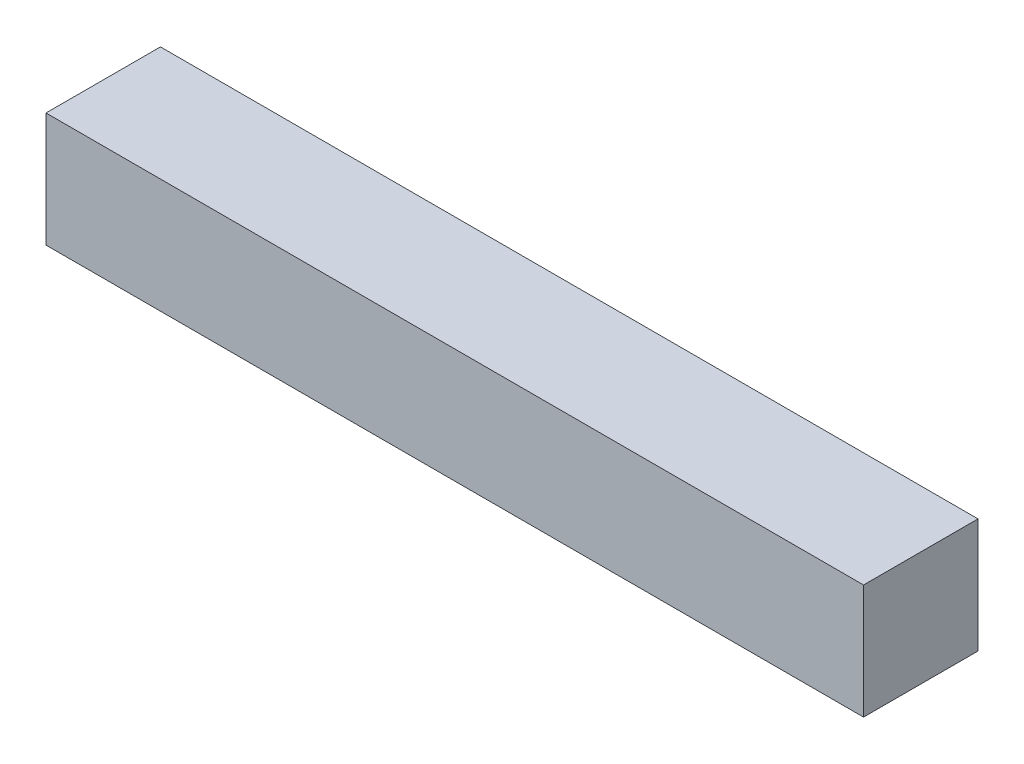
ISO-10303-21;
HEADER;
FILE_DESCRIPTION(('STEP AP214'),'2;1');
FILE_NAME('part.step','',(''),(''),'','','');
FILE_SCHEMA(('AUTOMOTIVE_DESIGN { 1 0 10303 214 1 1 1 1 }'));
ENDSEC;
DATA;
#1=APPLICATION_CONTEXT('core data for automotive mechanical design processes');
#2=APPLICATION_PROTOCOL_DEFINITION('international standard','automotive_design',2000,#1);
#3=PRODUCT_CONTEXT('',#1,'mechanical');
#4=PRODUCT('Part','Part','',(#3));
#5=PRODUCT_RELATED_PRODUCT_CATEGORY('part','',(#4));
#6=PRODUCT_DEFINITION_FORMATION('','',#4);
#7=PRODUCT_DEFINITION_CONTEXT('part definition',#1,'design');
#8=PRODUCT_DEFINITION('design','',#6,#7);
#9=PRODUCT_DEFINITION_SHAPE('','',#8);
#10=(LENGTH_UNIT() NAMED_UNIT(*) SI_UNIT(.MILLI.,.METRE.));
#11=(NAMED_UNIT(*) PLANE_ANGLE_UNIT() SI_UNIT($,.RADIAN.));
#12=(NAMED_UNIT(*) SI_UNIT($,.STERADIAN.) SOLID_ANGLE_UNIT());
#13=UNCERTAINTY_MEASURE_WITH_UNIT(LENGTH_MEASURE(1.E-05),#10,'distance_accuracy_value','');
#14=(GEOMETRIC_REPRESENTATION_CONTEXT(3) GLOBAL_UNCERTAINTY_ASSIGNED_CONTEXT((#13)) GLOBAL_UNIT_ASSIGNED_CONTEXT((#10,
#11,#12)) REPRESENTATION_CONTEXT('',''));
#15=CARTESIAN_POINT('',(0.,0.,0.));
#16=DIRECTION('',(0.,0.,1.));
#17=DIRECTION('',(1.,0.,0.));
#18=AXIS2_PLACEMENT_3D('',#15,#16,#17);
#19=CARTESIAN_POINT('',(0.,0.,0.));
#20=DIRECTION('',(0.,0.,1.));
#21=DIRECTION('',(1.,0.,0.));
#22=AXIS2_PLACEMENT_3D('',#19,#20,#21);
#23=PLANE('',#22);
#24=DIRECTION('',(0.,-1.,0.));
#25=VECTOR('',#24,1.);
#26=CARTESIAN_POINT('',(-15000.,7000.,0.));
#27=LINE('',#26,#25);
#28=CARTESIAN_POINT('',(-15000.,7000.,0.));
#29=VERTEX_POINT('',#28);
#30=CARTESIAN_POINT('',(-15000.,0.,0.));
#31=VERTEX_POINT('',#30);
#32=EDGE_CURVE('E345',#29,#31,#27,.T.);
#33=ORIENTED_EDGE('',*,*,#32,.F.);
#34=DIRECTION('',(-1.,0.,0.));
#35=VECTOR('',#34,1.);
#36=CARTESIAN_POINT('',(35000.,7000.,0.));
#37=LINE('',#36,#35);
#38=CARTESIAN_POINT('',(35000.,7000.,0.));
#39=VERTEX_POINT('',#38);
#40=EDGE_CURVE('E95',#39,#29,#37,.T.);
#41=ORIENTED_EDGE('',*,*,#40,.F.);
#42=DIRECTION('',(0.,1.,0.));
#43=VECTOR('',#42,1.);
#44=CARTESIAN_POINT('',(35000.,0.,0.));
#45=LINE('',#44,#43);
#46=CARTESIAN_POINT('',(35000.,0.,0.));
#47=VERTEX_POINT('',#46);
#48=EDGE_CURVE('E343',#47,#39,#45,.T.);
#49=ORIENTED_EDGE('',*,*,#48,.F.);
#50=DIRECTION('',(1.,0.,0.));
#51=VECTOR('',#50,1.);
#52=CARTESIAN_POINT('',(-15000.,0.,0.));
#53=LINE('',#52,#51);
#54=EDGE_CURVE('E334',#31,#47,#53,.T.);
#55=ORIENTED_EDGE('',*,*,#54,.F.);
#56=EDGE_LOOP('',(#33,#41,#49,#55));
#57=FACE_BOUND('',#56,.T.);
#58=DIRECTION('',(0.,-1.,0.));
#59=VECTOR('',#58,1.);
#60=CARTESIAN_POINT('',(99.9066587836865,800.,0.));
#61=LINE('',#60,#59);
#62=CARTESIAN_POINT('',(99.9066587836865,158.611679528378,0.));
#63=VERTEX_POINT('',#62);
#64=CARTESIAN_POINT('',(99.9066587836865,474.242430461089,0.));
#65=VERTEX_POINT('',#64);
#66=EDGE_CURVE('E11',#63,#65,#61,.F.);
#67=ORIENTED_EDGE('',*,*,#66,.F.);
#68=CARTESIAN_POINT('',(150.,300.,0.));
#69=DIRECTION('',(0.,0.,1.));
#70=DIRECTION('',(1.,0.,0.));
#71=AXIS2_PLACEMENT_3D('',#68,#69,#70);
#72=CIRCLE('',#71,150.);
#73=CARTESIAN_POINT('',(150.,150.,0.));
#74=VERTEX_POINT('',#73);
#75=EDGE_CURVE('E380',#63,#74,#72,.T.);
#76=ORIENTED_EDGE('',*,*,#75,.T.);
#77=DIRECTION('',(1.,0.,0.));
#78=VECTOR('',#77,1.);
#79=CARTESIAN_POINT('',(0.,150.,0.));
#80=LINE('',#79,#78);
#81=CARTESIAN_POINT('',(2301.451,150.,0.));
#82=VERTEX_POINT('',#81);
#83=EDGE_CURVE('E367',#74,#82,#80,.T.);
#84=ORIENTED_EDGE('',*,*,#83,.T.);
#85=DIRECTION('',(0.999048223992947,0.0436193321422773,0.));
#86=VECTOR('',#85,1.);
#87=CARTESIAN_POINT('',(-2.15782559269287,49.4223941585042,0.));
#88=LINE('',#87,#86);
#89=CARTESIAN_POINT('',(4861.84624149669,261.789128664863,0.));
#90=VERTEX_POINT('',#89);
#91=EDGE_CURVE('E370',#82,#90,#88,.T.);
#92=ORIENTED_EDGE('',*,*,#91,.T.);
#93=DIRECTION('',(0.,-1.,0.));
#94=VECTOR('',#93,1.);
#95=CARTESIAN_POINT('',(4861.84624149669,800.,0.));
#96=LINE('',#95,#94);
#97=CARTESIAN_POINT('',(4861.84624149668,303.459972211682,0.));
#98=VERTEX_POINT('',#97);
#99=EDGE_CURVE('E364',#98,#90,#96,.T.);
#100=ORIENTED_EDGE('',*,*,#99,.F.);
#101=DIRECTION('',(-0.985279818521785,0.170949346923816,0.));
#102=VECTOR('',#101,1.);
#103=CARTESIAN_POINT('',(193.193690698954,1113.48681897129,0.));
#104=LINE('',#103,#102);
#105=CARTESIAN_POINT('',(2197.056,765.81,0.));
#106=VERTEX_POINT('',#105);
#107=EDGE_CURVE('E359',#98,#106,#104,.T.);
#108=ORIENTED_EDGE('',*,*,#107,.T.);
#109=DIRECTION('',(-0.996313130885577,0.0857912887476274,0.));
#110=VECTOR('',#109,1.);
#111=CARTESIAN_POINT('',(81.6282514008476,947.96686131076,0.));
#112=LINE('',#111,#110);
#113=CARTESIAN_POINT('',(1800.,800.,0.));
#114=VERTEX_POINT('',#113);
#115=EDGE_CURVE('E360',#106,#114,#112,.T.);
#116=ORIENTED_EDGE('',*,*,#115,.T.);
#117=DIRECTION('',(1.,0.,0.));
#118=VECTOR('',#117,1.);
#119=CARTESIAN_POINT('',(0.,800.,0.));
#120=LINE('',#119,#118);
#121=CARTESIAN_POINT('',(1551.451,800.,0.));
#122=VERTEX_POINT('',#121);
#123=EDGE_CURVE('E361',#122,#114,#120,.T.);
#124=ORIENTED_EDGE('',*,*,#123,.F.);
#125=DIRECTION('',(-0.992522376322293,-0.122062821938327,0.));
#126=VECTOR('',#125,1.);
#127=CARTESIAN_POINT('',(-73.8044813669109,600.122117990456,0.));
#128=LINE('',#127,#126);
#129=CARTESIAN_POINT('',(1255.921,763.655,0.));
#130=VERTEX_POINT('',#129);
#131=EDGE_CURVE('E203',#122,#130,#128,.T.);
#132=ORIENTED_EDGE('',*,*,#131,.T.);
#133=DIRECTION('',(-0.970201590454346,-0.242299141310607,0.));
#134=VECTOR('',#133,1.);
#135=CARTESIAN_POINT('',(-105.785555519373,423.581006754064,0.));
#136=LINE('',#135,#134);
#137=CARTESIAN_POINT('',(113.655128803409,478.384348557619,0.));
#138=VERTEX_POINT('',#137);
#139=EDGE_CURVE('E372',#130,#138,#136,.T.);
#140=ORIENTED_EDGE('',*,*,#139,.T.);
#141=CARTESIAN_POINT('',(150.,332.854109989467,0.));
#142=DIRECTION('',(0.,0.,1.));
#143=DIRECTION('',(1.,0.,0.));
#144=AXIS2_PLACEMENT_3D('',#141,#142,#143);
#145=CIRCLE('',#144,150.);
#146=EDGE_CURVE('E54',#138,#65,#145,.T.);
#147=ORIENTED_EDGE('',*,*,#146,.T.);
#148=EDGE_LOOP('',(#67,#76,#84,#92,#100,#108,#116,#124,#132,#140,#147));
#149=FACE_BOUND('',#148,.T.);
#150=ADVANCED_FACE('F50',(#57,#149),#23,.F.);
#151=CARTESIAN_POINT('',(-15000.,7000.,7000.));
#152=DIRECTION('',(1.,0.,0.));
#153=DIRECTION('',(0.,0.,-1.));
#154=AXIS2_PLACEMENT_3D('',#151,#152,#153);
#155=PLANE('',#154);
#156=ORIENTED_EDGE('',*,*,#32,.T.);
#157=DIRECTION('',(0.,0.,-1.));
#158=VECTOR('',#157,1.);
#159=CARTESIAN_POINT('',(-15000.,0.,7000.));
#160=LINE('',#159,#158);
#161=CARTESIAN_POINT('',(-15000.,0.,7000.));
#162=VERTEX_POINT('',#161);
#163=EDGE_CURVE('E339',#162,#31,#160,.T.);
#164=ORIENTED_EDGE('',*,*,#163,.F.);
#165=DIRECTION('',(0.,-1.,0.));
#166=VECTOR('',#165,1.);
#167=CARTESIAN_POINT('',(-15000.,7000.,7000.));
#168=LINE('',#167,#166);
#169=CARTESIAN_POINT('',(-15000.,7000.,7000.));
#170=VERTEX_POINT('',#169);
#171=EDGE_CURVE('E349',#170,#162,#168,.T.);
#172=ORIENTED_EDGE('',*,*,#171,.F.);
#173=DIRECTION('',(0.,0.,-1.));
#174=VECTOR('',#173,1.);
#175=CARTESIAN_POINT('',(-15000.,7000.,7000.));
#176=LINE('',#175,#174);
#177=EDGE_CURVE('E354',#170,#29,#176,.T.);
#178=ORIENTED_EDGE('',*,*,#177,.T.);
#179=EDGE_LOOP('',(#156,#164,#172,#178));
#180=FACE_BOUND('',#179,.T.);
#181=ADVANCED_FACE('F47',(#180),#155,.F.);
#182=CARTESIAN_POINT('',(-15000.,0.,7000.));
#183=DIRECTION('',(0.,1.,0.));
#184=DIRECTION('',(0.,0.,1.));
#185=AXIS2_PLACEMENT_3D('',#182,#183,#184);
#186=PLANE('',#185);
#187=ORIENTED_EDGE('',*,*,#54,.T.);
#188=DIRECTION('',(0.,0.,-1.));
#189=VECTOR('',#188,1.);
#190=CARTESIAN_POINT('',(35000.,0.,7000.));
#191=LINE('',#190,#189);
#192=CARTESIAN_POINT('',(35000.,0.,7000.));
#193=VERTEX_POINT('',#192);
#194=EDGE_CURVE('E333',#193,#47,#191,.T.);
#195=ORIENTED_EDGE('',*,*,#194,.F.);
#196=DIRECTION('',(1.,0.,0.));
#197=VECTOR('',#196,1.);
#198=CARTESIAN_POINT('',(-15000.,0.,7000.));
#199=LINE('',#198,#197);
#200=EDGE_CURVE('E99',#162,#193,#199,.T.);
#201=ORIENTED_EDGE('',*,*,#200,.F.);
#202=ORIENTED_EDGE('',*,*,#163,.T.);
#203=EDGE_LOOP('',(#187,#195,#201,#202));
#204=FACE_BOUND('',#203,.T.);
#205=ADVANCED_FACE('F318',(#204),#186,.F.);
#206=CARTESIAN_POINT('',(35000.,0.,7000.));
#207=DIRECTION('',(-1.,0.,0.));
#208=DIRECTION('',(0.,0.,1.));
#209=AXIS2_PLACEMENT_3D('',#206,#207,#208);
#210=PLANE('',#209);
#211=ORIENTED_EDGE('',*,*,#48,.T.);
#212=DIRECTION('',(0.,0.,-1.));
#213=VECTOR('',#212,1.);
#214=CARTESIAN_POINT('',(35000.,7000.,7000.));
#215=LINE('',#214,#213);
#216=CARTESIAN_POINT('',(35000.,7000.,7000.));
#217=VERTEX_POINT('',#216);
#218=EDGE_CURVE('E347',#217,#39,#215,.T.);
#219=ORIENTED_EDGE('',*,*,#218,.F.);
#220=DIRECTION('',(0.,1.,0.));
#221=VECTOR('',#220,1.);
#222=CARTESIAN_POINT('',(35000.,0.,7000.));
#223=LINE('',#222,#221);
#224=EDGE_CURVE('E344',#193,#217,#223,.T.);
#225=ORIENTED_EDGE('',*,*,#224,.F.);
#226=ORIENTED_EDGE('',*,*,#194,.T.);
#227=EDGE_LOOP('',(#211,#219,#225,#226));
#228=FACE_BOUND('',#227,.T.);
#229=ADVANCED_FACE('F330',(#228),#210,.F.);
#230=CARTESIAN_POINT('',(35000.,7000.,7000.));
#231=DIRECTION('',(0.,-1.,0.));
#232=DIRECTION('',(0.,0.,-1.));
#233=AXIS2_PLACEMENT_3D('',#230,#231,#232);
#234=PLANE('',#233);
#235=ORIENTED_EDGE('',*,*,#40,.T.);
#236=ORIENTED_EDGE('',*,*,#177,.F.);
#237=DIRECTION('',(-1.,0.,0.));
#238=VECTOR('',#237,1.);
#239=CARTESIAN_POINT('',(35000.,7000.,7000.));
#240=LINE('',#239,#238);
#241=EDGE_CURVE('E72',#217,#170,#240,.T.);
#242=ORIENTED_EDGE('',*,*,#241,.F.);
#243=ORIENTED_EDGE('',*,*,#218,.T.);
#244=EDGE_LOOP('',(#235,#236,#242,#243));
#245=FACE_BOUND('',#244,.T.);
#246=ADVANCED_FACE('F322',(#245),#234,.F.);
#247=CARTESIAN_POINT('',(0.,0.,7000.));
#248=DIRECTION('',(0.,0.,1.));
#249=DIRECTION('',(1.,0.,0.));
#250=AXIS2_PLACEMENT_3D('',#247,#248,#249);
#251=PLANE('',#250);
#252=ORIENTED_EDGE('',*,*,#171,.T.);
#253=ORIENTED_EDGE('',*,*,#200,.T.);
#254=ORIENTED_EDGE('',*,*,#224,.T.);
#255=ORIENTED_EDGE('',*,*,#241,.T.);
#256=EDGE_LOOP('',(#252,#253,#254,#255));
#257=FACE_BOUND('',#256,.T.);
#258=ADVANCED_FACE('F323',(#257),#251,.T.);
#259=CARTESIAN_POINT('',(259.906658783687,800.,0.));
#260=DIRECTION('',(0.,-1.,0.));
#261=DIRECTION('',(0.,0.,-1.));
#262=AXIS2_PLACEMENT_3D('',#259,#260,#261);
#263=CYLINDRICAL_SURFACE('',#262,160.);
#264=ORIENTED_EDGE('',*,*,#66,.T.);
#265=CARTESIAN_POINT('',(113.655128803409,478.384348557619,-64.8882884535263));
#266=CARTESIAN_POINT('',(112.773939032918,478.164232994411,-62.9022135519065));
#267=CARTESIAN_POINT('',(111.933155729284,477.945795953748,-60.8980057661391));
#268=CARTESIAN_POINT('',(110.333625202495,477.516710712539,-56.8562236105316));
#269=CARTESIAN_POINT('',(109.574880662755,477.306062766917,-54.8186481517733));
#270=CARTESIAN_POINT('',(108.140474526136,476.896935722458,-50.7124900371555));
#271=CARTESIAN_POINT('',(107.464840130629,476.698460618308,-48.6438974768202));
#272=CARTESIAN_POINT('',(106.198137658814,476.317814583302,-44.4795123289952));
#273=CARTESIAN_POINT('',(105.607068680471,476.135643478542,-42.383720031898));
#274=CARTESIAN_POINT('',(104.511164120193,475.791492586405,-38.170326894472));
#275=CARTESIAN_POINT('',(104.006242210099,475.629492630005,-36.0527501682852));
#276=CARTESIAN_POINT('',(103.082932209994,475.328755377082,-31.7971598743901));
#277=CARTESIAN_POINT('',(102.66454431668,475.190018133439,-29.6591462602389));
#278=CARTESIAN_POINT('',(101.915268820844,474.938644041753,-25.3666448290491));
#279=CARTESIAN_POINT('',(101.58436782491,474.826003198927,-23.2121595856826));
#280=CARTESIAN_POINT('',(101.010740244002,474.629088177567,-18.8901866979926));
#281=CARTESIAN_POINT('',(100.768013552683,474.544813964819,-16.7226990693543));
#282=CARTESIAN_POINT('',(100.37076423608,474.406161867699,-12.3726224328995));
#283=CARTESIAN_POINT('',(100.21648827366,474.351867603903,-10.1900082088244));
#284=CARTESIAN_POINT('',(99.9975671230742,474.274653761924,-5.8197269539753));
#285=CARTESIAN_POINT('',(99.9329221235669,474.251734249778,-3.6320599125758));
#286=CARTESIAN_POINT('',(99.8934242819721,474.237742403755,0.744450738233998));
#287=CARTESIAN_POINT('',(99.9185822486834,474.246673903504,2.93329445756778));
#288=CARTESIAN_POINT('',(100.058650209219,474.296207977458,7.30773390133307));
#289=CARTESIAN_POINT('',(100.173559683034,474.336810368165,9.49332964450949));
#290=CARTESIAN_POINT('',(100.492693380218,474.448796061191,13.8551440212282));
#291=CARTESIAN_POINT('',(100.696834271621,474.520150643601,16.0313694952312));
#292=CARTESIAN_POINT('',(101.193919943739,474.692171407193,20.3725274347643));
#293=CARTESIAN_POINT('',(101.486866629951,474.792838217323,22.5374596569623));
#294=CARTESIAN_POINT('',(102.16078590948,475.021392150112,26.8515295793954));
#295=CARTESIAN_POINT('',(102.541734866669,475.149271963028,29.0006713610749));
#296=CARTESIAN_POINT('',(103.390811659426,475.429645345374,33.2798357862657));
#297=CARTESIAN_POINT('',(103.8589325439,475.582136952128,35.4098599400322));
#298=CARTESIAN_POINT('',(104.936939869616,475.926381416005,39.8776210107061));
#299=CARTESIAN_POINT('',(105.556701493798,476.120599632764,42.2127912998076));
#300=CARTESIAN_POINT('',(106.900536974426,476.5305848942,46.8503359801782));
#301=CARTESIAN_POINT('',(107.624586121608,476.746346830732,49.1527179985066));
#302=CARTESIAN_POINT('',(109.174416422244,477.193713901137,53.7177097487012));
#303=CARTESIAN_POINT('',(110.000046911566,477.425295350108,55.9803728286771));
#304=CARTESIAN_POINT('',(111.314153213711,477.78033591011,59.3440574899915));
#305=CARTESIAN_POINT('',(111.764862264654,477.899976882307,60.4603772225236));
#306=CARTESIAN_POINT('',(112.691287391964,478.141029180627,62.6823991134769));
#307=CARTESIAN_POINT('',(113.167003475438,478.262440507252,63.7881012688804));
#308=CARTESIAN_POINT('',(113.655128803409,478.384348557619,64.8882884535263));
#309=B_SPLINE_CURVE_WITH_KNOTS('',3,(#265,#266,#267,#268,#269,#270,#271,#272,#273,#274,#275,
#276,#277,#278,#279,#280,#281,#282,#283,#284,#285,#286,#287,#288,#289,#290,#291,#292,#293,#294,
#295,#296,#297,#298,#299,#300,#301,#302,#303,#304,#305,#306,#307,#308),.UNSPECIFIED.,.F.,.F.,(4,
2,2,2,2,2,2,2,2,2,2,2,2,2,2,2,2,2,2,2,2,4),(0.,6.55129299468972,13.1028002115112,
19.6564460177392,26.2100219127685,32.7569913826109,39.3039757340479,45.849957223369,
52.3959308176641,58.9600714939326,65.5242259865694,72.089170575798,78.6540771287231,
85.2128658627705,91.7717953380148,98.3289652243589,104.885612465355,112.154383970393,
119.421436080517,126.677836867381,130.306981102657,133.936126369311),.UNSPECIFIED.);
#310=CARTESIAN_POINT('',(113.655128803409,478.384348557619,64.8882884535251));
#311=VERTEX_POINT('',#310);
#312=EDGE_CURVE('E248',#65,#311,#309,.T.);
#313=ORIENTED_EDGE('',*,*,#312,.T.);
#314=CARTESIAN_POINT('',(259.906658783687,514.909355812027,0.));
#315=DIRECTION('',(-0.242299141310607,0.970201590454346,0.));
#316=DIRECTION('',(-0.970201590454346,-0.242299141310607,0.));
#317=AXIS2_PLACEMENT_3D('',#314,#315,#316);
#318=ELLIPSE('',#317,164.914180283988,160.);
#319=CARTESIAN_POINT('',(161.409759474517,490.310639051325,126.088702215857));
#320=VERTEX_POINT('',#319);
#321=EDGE_CURVE('E387',#311,#320,#318,.T.);
#322=ORIENTED_EDGE('',*,*,#321,.T.);
#323=DIRECTION('',(0.,-1.,0.));
#324=VECTOR('',#323,1.);
#325=CARTESIAN_POINT('',(161.409759474516,800.,126.088702215857));
#326=LINE('',#325,#324);
#327=CARTESIAN_POINT('',(161.409759474516,150.,126.088702215857));
#328=VERTEX_POINT('',#327);
#329=EDGE_CURVE('E244',#320,#328,#326,.T.);
#330=ORIENTED_EDGE('',*,*,#329,.T.);
#331=CARTESIAN_POINT('',(259.906658783687,150.,0.));
#332=DIRECTION('',(0.,-1.,0.));
#333=DIRECTION('',(0.,0.,-1.));
#334=AXIS2_PLACEMENT_3D('',#331,#332,#333);
#335=CIRCLE('',#334,160.);
#336=CARTESIAN_POINT('',(150.,150.,116.277798203296));
#337=VERTEX_POINT('',#336);
#338=EDGE_CURVE('E409',#328,#337,#335,.T.);
#339=ORIENTED_EDGE('',*,*,#338,.T.);
#340=CARTESIAN_POINT('',(150.,150.,116.277798203296));
#341=CARTESIAN_POINT('',(149.197227518988,150.000000444739,115.519013001234));
#342=CARTESIAN_POINT('',(148.402349323817,150.006444551494,114.751945115754));
#343=CARTESIAN_POINT('',(146.828761077162,150.031461689993,113.201629596887));
#344=CARTESIAN_POINT('',(146.050050642098,150.050034433644,112.418382348238));
#345=CARTESIAN_POINT('',(143.738992605803,150.122798834219,110.045212540939));
#346=CARTESIAN_POINT('',(142.231396084721,150.194037269926,108.43155736251));
#347=CARTESIAN_POINT('',(139.286546373212,150.375814699117,105.145862331909));
#348=CARTESIAN_POINT('',(137.849239225862,150.486322991144,103.473869007217));
#349=CARTESIAN_POINT('',(135.046053340973,150.740627964951,100.073395601841));
#350=CARTESIAN_POINT('',(133.68017721911,150.884425864692,98.3449134563993));
#351=CARTESIAN_POINT('',(131.023003065829,151.199252798717,94.8358771461094));
#352=CARTESIAN_POINT('',(129.731654200361,151.37026296545,93.0553597529595));
#353=CARTESIAN_POINT('',(127.224251842487,151.733785604688,89.4439038255723));
#354=CARTESIAN_POINT('',(126.008207640174,151.926300722009,87.6129591103741));
#355=CARTESIAN_POINT('',(123.653075843413,152.327163170553,83.903449669022));
#356=CARTESIAN_POINT('',(122.514002675644,152.535513454298,82.0248761060328));
#357=CARTESIAN_POINT('',(120.314753352958,152.962451132073,78.2235331504458));
#358=CARTESIAN_POINT('',(119.254568306852,153.181037367909,76.3007687705009));
#359=CARTESIAN_POINT('',(117.216364660646,153.622684269366,72.4173979297617));
#360=CARTESIAN_POINT('',(116.238193444443,153.84573562226,70.4568704991598));
#361=CARTESIAN_POINT('',(114.363161419552,154.291577394139,66.4972847107507));
#362=CARTESIAN_POINT('',(113.466300511938,154.514367813441,64.4982263998262));
#363=CARTESIAN_POINT('',(111.755279479412,154.954759642745,60.464600680722));
#364=CARTESIAN_POINT('',(110.941114441265,155.172361360436,58.4300353905561));
#365=CARTESIAN_POINT('',(109.396721623774,155.597730716471,54.3282724139933));
#366=CARTESIAN_POINT('',(108.666493845211,155.805498354724,52.2610747272926));
#367=CARTESIAN_POINT('',(107.291517437633,156.206751675774,48.0980446572108));
#368=CARTESIAN_POINT('',(106.646732773703,156.400243363975,46.0022247590141));
#369=CARTESIAN_POINT('',(105.443470641596,156.769026649784,41.784363149105));
#370=CARTESIAN_POINT('',(104.884993033115,156.944318276979,39.6623214800257));
#371=CARTESIAN_POINT('',(103.855447732851,157.273084547455,35.3954250788466));
#372=CARTESIAN_POINT('',(103.384381074604,157.426558932767,33.2505700773215));
#373=CARTESIAN_POINT('',(102.530668116976,157.708522147084,28.9416891731522));
#374=CARTESIAN_POINT('',(102.148022100941,157.837010896023,26.7776632090972));
#375=CARTESIAN_POINT('',(101.465667462759,158.068499170636,22.3934355301932));
#376=CARTESIAN_POINT('',(101.16765188495,158.170974528566,20.1729421971747));
#377=CARTESIAN_POINT('',(100.665032437988,158.345025688778,15.7201891996206));
#378=CARTESIAN_POINT('',(100.460428869546,158.416601391587,13.4879294972302));
#379=CARTESIAN_POINT('',(100.145158117363,158.527307591484,9.01595322708888));
#380=CARTESIAN_POINT('',(100.034491923749,158.566437746585,6.77623658098935));
#381=CARTESIAN_POINT('',(99.9073913706489,158.611403854638,2.29379848782876));
#382=CARTESIAN_POINT('',(99.890956852716,158.617239863573,0.0510770458265141));
#383=CARTESIAN_POINT('',(99.9523649444744,158.595490600866,-4.43306367901725));
#384=CARTESIAN_POINT('',(100.030213962676,158.567903057404,-6.67448286298269));
#385=CARTESIAN_POINT('',(100.279994263522,158.479900598214,-11.1514286514722));
#386=CARTESIAN_POINT('',(100.45192582509,158.419485585163,-13.3869552385069));
#387=CARTESIAN_POINT('',(100.889419452544,158.267136953808,-17.8476868417839));
#388=CARTESIAN_POINT('',(101.154979400206,158.175204048558,-20.0728920903795));
#389=CARTESIAN_POINT('',(101.779063595891,157.961800844771,-24.5087784389172));
#390=CARTESIAN_POINT('',(102.137587017684,157.840330808752,-26.7194596677651));
#391=CARTESIAN_POINT('',(102.926775780276,157.577123600622,-31.013612685877));
#392=CARTESIAN_POINT('',(103.353010132429,157.436681731273,-33.097980323524));
#393=CARTESIAN_POINT('',(104.287844992139,157.134188084224,-37.2465553021806));
#394=CARTESIAN_POINT('',(104.796444743854,156.972136504832,-39.3107628280093));
#395=CARTESIAN_POINT('',(105.895018848793,156.629565097021,-43.4157709760835));
#396=CARTESIAN_POINT('',(106.484990458811,156.449045891235,-45.4565723848841));
#397=CARTESIAN_POINT('',(107.745269602171,156.073038938233,-49.5118169088477));
#398=CARTESIAN_POINT('',(108.415577358716,155.87755114943,-51.5262599507604));
#399=CARTESIAN_POINT('',(109.835448832084,155.475423435206,-55.5259909350783));
#400=CARTESIAN_POINT('',(110.585016389714,155.268782969582,-57.5112774592899));
#401=CARTESIAN_POINT('',(112.16222299892,154.848463183412,-61.4498304520931));
#402=CARTESIAN_POINT('',(112.989862077777,154.634783860406,-63.4030969094955));
#403=CARTESIAN_POINT('',(114.722056314859,154.204722154663,-67.2750290342799));
#404=CARTESIAN_POINT('',(115.626615162842,153.988339642681,-69.1936930364625));
#405=CARTESIAN_POINT('',(117.511377819577,153.557438268491,-72.9937124329084));
#406=CARTESIAN_POINT('',(118.491581457163,153.342919402067,-74.8750679115794));
#407=CARTESIAN_POINT('',(120.50777368734,152.924342060301,-78.5639102097275));
#408=CARTESIAN_POINT('',(121.542417530248,152.72016412512,-80.3721185349167));
#409=CARTESIAN_POINT('',(123.682199302699,152.32279256364,-83.9478298250324));
#410=CARTESIAN_POINT('',(124.787344283253,152.129600039689,-85.71532869436));
#411=CARTESIAN_POINT('',(127.066448812287,151.759031112758,-89.2066346063971));
#412=CARTESIAN_POINT('',(128.240395586125,151.581651789015,-90.93044967541));
#413=CARTESIAN_POINT('',(130.655656175891,151.247580067016,-94.3320138856591));
#414=CARTESIAN_POINT('',(131.896962496124,151.090885373631,-96.0097681213311));
#415=CARTESIAN_POINT('',(134.446592080053,150.803019950715,-99.3183641400926));
#416=CARTESIAN_POINT('',(135.754977031146,150.671873267667,-100.949160506855));
#417=CARTESIAN_POINT('',(138.435759352656,150.44038541193,-104.159463428637));
#418=CARTESIAN_POINT('',(139.80815467633,150.340043255038,-105.73897162087));
#419=CARTESIAN_POINT('',(142.615869629206,150.1752575045,-108.845099188879));
#420=CARTESIAN_POINT('',(144.051233647806,150.110839688822,-110.371679851087));
#421=CARTESIAN_POINT('',(146.981580403563,150.023207631752,-113.368082399426));
#422=CARTESIAN_POINT('',(148.476570551277,149.999998528351,-114.83789718552));
#423=CARTESIAN_POINT('',(150.,150.,-116.277798203296));
#424=B_SPLINE_CURVE_WITH_KNOTS('',3,(#340,#341,#342,#343,#344,#345,#346,#347,#348,#349,#350,
#351,#352,#353,#354,#355,#356,#357,#358,#359,#360,#361,#362,#363,#364,#365,#366,#367,#368,#369,
#370,#371,#372,#373,#374,#375,#376,#377,#378,#379,#380,#381,#382,#383,#384,#385,#386,#387,#388,
#389,#390,#391,#392,#393,#394,#395,#396,#397,#398,#399,#400,#401,#402,#403,#404,#405,#406,#407,
#408,#409,#410,#411,#412,#413,#414,#415,#416,#417,#418,#419,#420,#421,#422,#423),.UNSPECIFIED.,
.F.,.F.,(4,2,2,2,2,2,2,2,2,2,2,2,2,2,2,2,2,2,2,2,2,2,2,2,2,2,2,2,2,2,2,2,2,2,2,2,2,2,2,2,2,4),
(0.,3.31371001652165,6.6273413252176,13.2532751900694,19.8740402078589,26.4950474965277,
33.1114839710399,39.7287350744754,46.3472230285733,52.9649639039089,59.5701033647869,
66.1752347893612,72.7799735513195,79.3847123747196,85.9866567792438,92.5885904512923,
99.1906021788814,105.792635062468,112.518689760155,119.244766110194,125.970913354141,
132.697049288266,139.42364242767,146.150255509359,152.876716419738,159.6031175495,
165.997719115792,172.392262004002,178.786589372256,185.180934506686,191.57558964331,
197.970247014477,204.365211303699,210.760161123149,217.03838877844,223.317245323713,
229.594939724959,235.871936978217,242.154814065331,248.437490393972,254.72466915517,
261.012631760361),.UNSPECIFIED.);
#425=EDGE_CURVE('E254',#337,#63,#424,.T.);
#426=ORIENTED_EDGE('',*,*,#425,.T.);
#427=EDGE_LOOP('',(#264,#313,#322,#330,#339,#426));
#428=FACE_BOUND('',#427,.T.);
#429=ADVANCED_FACE('F265',(#428),#263,.F.);
#430=CARTESIAN_POINT('',(4831.84624149669,800.,0.));
#431=DIRECTION('',(0.,-1.,0.));
#432=DIRECTION('',(0.,0.,-1.));
#433=AXIS2_PLACEMENT_3D('',#430,#431,#432);
#434=CYLINDRICAL_SURFACE('',#433,30.);
#435=ORIENTED_EDGE('',*,*,#99,.T.);
#436=CARTESIAN_POINT('',(4831.84624149669,260.479302039039,0.));
#437=DIRECTION('',(0.0436193321422773,-0.999048223992947,0.));
#438=DIRECTION('',(-0.999048223992947,-0.0436193321422773,0.));
#439=AXIS2_PLACEMENT_3D('',#436,#437,#438);
#440=ELLIPSE('',#439,30.028580482429,30.);
#441=CARTESIAN_POINT('',(4839.46343464738,260.811875452466,29.0168635194273));
#442=VERTEX_POINT('',#441);
#443=EDGE_CURVE('E425',#90,#442,#440,.T.);
#444=ORIENTED_EDGE('',*,*,#443,.T.);
#445=DIRECTION('',(0.,-1.,0.));
#446=VECTOR('',#445,1.);
#447=CARTESIAN_POINT('',(4839.46343464738,800.,29.0168635194273));
#448=LINE('',#447,#446);
#449=CARTESIAN_POINT('',(4839.46343464738,307.343464130711,29.0168635194273));
#450=VERTEX_POINT('',#449);
#451=EDGE_CURVE('E224',#450,#442,#448,.T.);
#452=ORIENTED_EDGE('',*,*,#451,.F.);
#453=CARTESIAN_POINT('',(4831.84624149669,308.665072642348,0.));
#454=DIRECTION('',(0.170949346923816,0.985279818521785,0.));
#455=DIRECTION('',(0.985279818521785,-0.170949346923816,0.));
#456=AXIS2_PLACEMENT_3D('',#453,#454,#455);
#457=ELLIPSE('',#456,30.4482030749488,30.);
#458=EDGE_CURVE('E223',#450,#98,#457,.T.);
#459=ORIENTED_EDGE('',*,*,#458,.T.);
#460=EDGE_LOOP('',(#435,#444,#452,#459));
#461=FACE_BOUND('',#460,.T.);
#462=ADVANCED_FACE('F284',(#461),#434,.F.);
#463=CARTESIAN_POINT('',(4831.84624149669,800.,0.));
#464=DIRECTION('',(0.,-1.,0.));
#465=DIRECTION('',(0.,0.,-1.));
#466=AXIS2_PLACEMENT_3D('',#463,#464,#465);
#467=PLANE('',#466);
#468=ORIENTED_EDGE('',*,*,#123,.T.);
#469=DIRECTION('',(0.,0.,1.));
#470=VECTOR('',#469,1.);
#471=CARTESIAN_POINT('',(1800.,800.,-800.));
#472=LINE('',#471,#470);
#473=CARTESIAN_POINT('',(1800.,800.,774.186306010782));
#474=VERTEX_POINT('',#473);
#475=EDGE_CURVE('E65',#114,#474,#472,.T.);
#476=ORIENTED_EDGE('',*,*,#475,.T.);
#477=DIRECTION('',(0.99177330783374,0.,-0.128006663375473));
#478=VECTOR('',#477,1.);
#479=CARTESIAN_POINT('',(2195.064,800.,723.196));
#480=LINE('',#479,#478);
#481=CARTESIAN_POINT('',(1600.,800.,800.));
#482=VERTEX_POINT('',#481);
#483=EDGE_CURVE('E219',#482,#474,#480,.T.);
#484=ORIENTED_EDGE('',*,*,#483,.F.);
#485=DIRECTION('',(1.,0.,0.));
#486=VECTOR('',#485,1.);
#487=CARTESIAN_POINT('',(1600.,800.,800.));
#488=LINE('',#487,#486);
#489=CARTESIAN_POINT('',(1551.451,800.,800.));
#490=VERTEX_POINT('',#489);
#491=EDGE_CURVE('E211',#490,#482,#488,.T.);
#492=ORIENTED_EDGE('',*,*,#491,.F.);
#493=DIRECTION('',(0.,0.,1.));
#494=VECTOR('',#493,1.);
#495=CARTESIAN_POINT('',(1551.451,800.,-800.));
#496=LINE('',#495,#494);
#497=EDGE_CURVE('E191',#122,#490,#496,.T.);
#498=ORIENTED_EDGE('',*,*,#497,.F.);
#499=EDGE_LOOP('',(#468,#476,#484,#492,#498));
#500=FACE_BOUND('',#499,.T.);
#501=ADVANCED_FACE('F217',(#500),#467,.T.);
#502=CARTESIAN_POINT('',(113.655128803409,478.384348557619,-800.));
#503=DIRECTION('',(-0.242299141310607,0.970201590454346,0.));
#504=DIRECTION('',(-0.970201590454346,-0.242299141310607,0.));
#505=AXIS2_PLACEMENT_3D('',#502,#503,#504);
#506=PLANE('',#505);
#507=DIRECTION('',(0.,0.,1.));
#508=VECTOR('',#507,1.);
#509=CARTESIAN_POINT('',(1255.921,763.655,-800.));
#510=LINE('',#509,#508);
#511=CARTESIAN_POINT('',(1255.921,763.655,774.339123964959));
#512=VERTEX_POINT('',#511);
#513=EDGE_CURVE('E389',#130,#512,#510,.T.);
#514=ORIENTED_EDGE('',*,*,#513,.T.);
#515=DIRECTION('',(0.956308883695465,0.238829562460936,0.168623127298276));
#516=VECTOR('',#515,1.);
#517=CARTESIAN_POINT('',(1401.45104302585,799.999822361657,800.000007586622));
#518=LINE('',#517,#516);
#519=CARTESIAN_POINT('',(1076.464,718.837224570654,742.696));
#520=VERTEX_POINT('',#519);
#521=EDGE_CURVE('E397',#520,#512,#518,.T.);
#522=ORIENTED_EDGE('',*,*,#521,.F.);
#523=DIRECTION('',(0.890658508940707,0.222433970466134,0.396548293697232));
#524=VECTOR('',#523,1.);
#525=CARTESIAN_POINT('',(1092.5433772675,722.852904758212,749.85502846617));
#526=LINE('',#525,#524);
#527=CARTESIAN_POINT('',(784.13,645.82943126996,612.54));
#528=VERTEX_POINT('',#527);
#529=EDGE_CURVE('E403',#528,#520,#526,.T.);
#530=ORIENTED_EDGE('',*,*,#529,.F.);
#531=DIRECTION('',(0.773221678679863,0.193105175903845,0.604018730387262));
#532=VECTOR('',#531,1.);
#533=CARTESIAN_POINT('',(807.149686821474,651.578391491176,630.522323040345));
#534=LINE('',#533,#532);
#535=EDGE_CURVE('E405',#320,#528,#534,.T.);
#536=ORIENTED_EDGE('',*,*,#535,.F.);
#537=ORIENTED_EDGE('',*,*,#321,.F.);
#538=DIRECTION('',(0.,0.,1.));
#539=VECTOR('',#538,1.);
#540=CARTESIAN_POINT('',(113.655128803409,478.384348557619,-800.));
#541=LINE('',#540,#539);
#542=EDGE_CURVE('E382',#138,#311,#541,.T.);
#543=ORIENTED_EDGE('',*,*,#542,.F.);
#544=ORIENTED_EDGE('',*,*,#139,.F.);
#545=EDGE_LOOP('',(#514,#522,#530,#536,#537,#543,#544));
#546=FACE_BOUND('',#545,.T.);
#547=ADVANCED_FACE('F274',(#546),#506,.F.);
#548=CARTESIAN_POINT('',(1255.921,763.655,-800.));
#549=DIRECTION('',(-0.122062821938327,0.992522376322293,0.));
#550=DIRECTION('',(-0.992522376322293,-0.122062821938327,0.));
#551=AXIS2_PLACEMENT_3D('',#548,#549,#550);
#552=PLANE('',#551);
#553=ORIENTED_EDGE('',*,*,#497,.T.);
#554=DIRECTION('',(-0.992522376322293,-0.122062821938327,0.));
#555=VECTOR('',#554,1.);
#556=CARTESIAN_POINT('',(1255.921,763.655,800.));
#557=LINE('',#556,#555);
#558=CARTESIAN_POINT('',(1401.451,781.55263425033,800.));
#559=VERTEX_POINT('',#558);
#560=EDGE_CURVE('E197',#490,#559,#557,.T.);
#561=ORIENTED_EDGE('',*,*,#560,.T.);
#562=DIRECTION('',(0.977663361324776,0.120235424042734,0.172388499408761));
#563=VECTOR('',#562,1.);
#564=CARTESIAN_POINT('',(1403.61948357921,781.819319648382,800.382362319179));
#565=LINE('',#564,#563);
#566=EDGE_CURVE('E413',#512,#559,#565,.T.);
#567=ORIENTED_EDGE('',*,*,#566,.F.);
#568=ORIENTED_EDGE('',*,*,#513,.F.);
#569=ORIENTED_EDGE('',*,*,#131,.F.);
#570=EDGE_LOOP('',(#553,#561,#567,#568,#569));
#571=FACE_BOUND('',#570,.T.);
#572=ADVANCED_FACE('F194',(#571),#552,.F.);
#573=CARTESIAN_POINT('',(150.,332.854109989467,-800.));
#574=DIRECTION('',(0.,0.,1.));
#575=DIRECTION('',(1.,0.,0.));
#576=AXIS2_PLACEMENT_3D('',#573,#574,#575);
#577=CYLINDRICAL_SURFACE('',#576,150.);
#578=ORIENTED_EDGE('',*,*,#542,.T.);
#579=ORIENTED_EDGE('',*,*,#312,.F.);
#580=ORIENTED_EDGE('',*,*,#146,.F.);
#581=EDGE_LOOP('',(#578,#579,#580));
#582=FACE_BOUND('',#581,.T.);
#583=ADVANCED_FACE('F266',(#582),#577,.F.);
#584=CARTESIAN_POINT('',(2301.451,150.,-800.));
#585=DIRECTION('',(0.,-1.,0.));
#586=DIRECTION('',(0.,0.,-1.));
#587=AXIS2_PLACEMENT_3D('',#584,#585,#586);
#588=PLANE('',#587);
#589=DIRECTION('',(0.,0.,1.));
#590=VECTOR('',#589,1.);
#591=CARTESIAN_POINT('',(150.,150.,-800.));
#592=LINE('',#591,#590);
#593=EDGE_CURVE('E390',#74,#337,#592,.T.);
#594=ORIENTED_EDGE('',*,*,#593,.T.);
#595=ORIENTED_EDGE('',*,*,#338,.F.);
#596=DIRECTION('',(-0.788054388849103,0.,-0.615605620682322));
#597=VECTOR('',#596,1.);
#598=CARTESIAN_POINT('',(784.13,150.,612.54));
#599=LINE('',#598,#597);
#600=CARTESIAN_POINT('',(784.13,150.,612.54));
#601=VERTEX_POINT('',#600);
#602=EDGE_CURVE('E415',#601,#328,#599,.T.);
#603=ORIENTED_EDGE('',*,*,#602,.F.);
#604=DIRECTION('',(-0.913544856728147,0.,-0.406737992749078));
#605=VECTOR('',#604,1.);
#606=CARTESIAN_POINT('',(1076.464,150.,742.696));
#607=LINE('',#606,#605);
#608=CARTESIAN_POINT('',(1076.464,150.,742.696));
#609=VERTEX_POINT('',#608);
#610=EDGE_CURVE('E416',#609,#601,#607,.T.);
#611=ORIENTED_EDGE('',*,*,#610,.F.);
#612=DIRECTION('',(-0.98480774082361,0.,-0.173648246791891));
#613=VECTOR('',#612,1.);
#614=CARTESIAN_POINT('',(1401.451,150.,800.));
#615=LINE('',#614,#613);
#616=CARTESIAN_POINT('',(1401.451,150.,800.));
#617=VERTEX_POINT('',#616);
#618=EDGE_CURVE('E418',#617,#609,#615,.T.);
#619=ORIENTED_EDGE('',*,*,#618,.F.);
#620=DIRECTION('',(1.,0.,0.));
#621=VECTOR('',#620,1.);
#622=CARTESIAN_POINT('',(2301.451,150.,800.));
#623=LINE('',#622,#621);
#624=CARTESIAN_POINT('',(1600.,150.,800.));
#625=VERTEX_POINT('',#624);
#626=EDGE_CURVE('E214',#617,#625,#623,.T.);
#627=ORIENTED_EDGE('',*,*,#626,.T.);
#628=DIRECTION('',(-0.99177330783374,0.,0.128006663375473));
#629=VECTOR('',#628,1.);
#630=CARTESIAN_POINT('',(2195.064,150.,723.196));
#631=LINE('',#630,#629);
#632=CARTESIAN_POINT('',(2195.064,150.,723.196));
#633=VERTEX_POINT('',#632);
#634=EDGE_CURVE('E412',#633,#625,#631,.T.);
#635=ORIENTED_EDGE('',*,*,#634,.F.);
#636=DIRECTION('',(-0.967228783980897,0.,0.253906438356408));
#637=VECTOR('',#636,1.);
#638=CARTESIAN_POINT('',(4839.46343464738,150.,29.0168635194273));
#639=LINE('',#638,#637);
#640=CARTESIAN_POINT('',(2301.451,150.,695.268435493238));
#641=VERTEX_POINT('',#640);
#642=EDGE_CURVE('E402',#641,#633,#639,.T.);
#643=ORIENTED_EDGE('',*,*,#642,.F.);
#644=DIRECTION('',(0.,0.,1.));
#645=VECTOR('',#644,1.);
#646=CARTESIAN_POINT('',(2301.451,150.,-800.));
#647=LINE('',#646,#645);
#648=EDGE_CURVE('E388',#82,#641,#647,.T.);
#649=ORIENTED_EDGE('',*,*,#648,.F.);
#650=ORIENTED_EDGE('',*,*,#83,.F.);
#651=EDGE_LOOP('',(#594,#595,#603,#611,#619,#627,#635,#643,#649,#650));
#652=FACE_BOUND('',#651,.T.);
#653=ADVANCED_FACE('F269',(#652),#588,.F.);
#654=CARTESIAN_POINT('',(4950.,265.638,-800.));
#655=DIRECTION('',(0.0436193321422773,-0.999048223992947,0.));
#656=DIRECTION('',(0.999048223992947,0.0436193321422773,0.));
#657=AXIS2_PLACEMENT_3D('',#654,#655,#656);
#658=PLANE('',#657);
#659=ORIENTED_EDGE('',*,*,#648,.T.);
#660=DIRECTION('',(-0.966367468305207,-0.0421924613438821,0.253680335081632));
#661=VECTOR('',#660,1.);
#662=CARTESIAN_POINT('',(4861.44797961414,261.771740197603,23.2457185702208));
#663=LINE('',#662,#661);
#664=EDGE_CURVE('E424',#442,#641,#663,.T.);
#665=ORIENTED_EDGE('',*,*,#664,.F.);
#666=ORIENTED_EDGE('',*,*,#443,.F.);
#667=ORIENTED_EDGE('',*,*,#91,.F.);
#668=EDGE_LOOP('',(#659,#665,#666,#667));
#669=FACE_BOUND('',#668,.T.);
#670=ADVANCED_FACE('F434',(#669),#658,.F.);
#671=CARTESIAN_POINT('',(150.,300.,-800.));
#672=DIRECTION('',(0.,0.,1.));
#673=DIRECTION('',(1.,0.,0.));
#674=AXIS2_PLACEMENT_3D('',#671,#672,#673);
#675=CYLINDRICAL_SURFACE('',#674,150.);
#676=ORIENTED_EDGE('',*,*,#425,.F.);
#677=ORIENTED_EDGE('',*,*,#593,.F.);
#678=ORIENTED_EDGE('',*,*,#75,.F.);
#679=EDGE_LOOP('',(#676,#677,#678));
#680=FACE_BOUND('',#679,.T.);
#681=ADVANCED_FACE('F275',(#680),#675,.F.);
#682=CARTESIAN_POINT('',(2197.056,765.81,-800.));
#683=DIRECTION('',(0.170949346923816,0.985279818521785,0.));
#684=DIRECTION('',(-0.985279818521785,0.170949346923816,0.));
#685=AXIS2_PLACEMENT_3D('',#682,#683,#684);
#686=PLANE('',#685);
#687=ORIENTED_EDGE('',*,*,#458,.F.);
#688=DIRECTION('',(0.953889991686832,-0.165503106884578,-0.250404882882197));
#689=VECTOR('',#688,1.);
#690=CARTESIAN_POINT('',(4761.68688160886,320.837956454594,49.4339229542904));
#691=LINE('',#690,#689);
#692=CARTESIAN_POINT('',(2197.056,765.81,722.673081706435));
#693=VERTEX_POINT('',#692);
#694=EDGE_CURVE('E222',#693,#450,#691,.T.);
#695=ORIENTED_EDGE('',*,*,#694,.F.);
#696=DIRECTION('',(0.,0.,1.));
#697=VECTOR('',#696,1.);
#698=CARTESIAN_POINT('',(2197.056,765.81,-800.));
#699=LINE('',#698,#697);
#700=EDGE_CURVE('E206',#106,#693,#699,.T.);
#701=ORIENTED_EDGE('',*,*,#700,.F.);
#702=ORIENTED_EDGE('',*,*,#107,.F.);
#703=EDGE_LOOP('',(#687,#695,#701,#702));
#704=FACE_BOUND('',#703,.T.);
#705=ADVANCED_FACE('F309',(#704),#686,.F.);
#706=CARTESIAN_POINT('',(1800.,800.,-800.));
#707=DIRECTION('',(0.0857912887476274,0.996313130885577,0.));
#708=DIRECTION('',(-0.996313130885577,0.0857912887476274,0.));
#709=AXIS2_PLACEMENT_3D('',#706,#707,#708);
#710=PLANE('',#709);
#711=ORIENTED_EDGE('',*,*,#700,.T.);
#712=DIRECTION('',(0.963891447163198,-0.0829994977497124,-0.253030356793275));
#713=VECTOR('',#712,1.);
#714=CARTESIAN_POINT('',(4818.52482445617,540.078568896688,34.5134409846886));
#715=LINE('',#714,#713);
#716=CARTESIAN_POINT('',(2195.064,765.98152865087,723.196));
#717=VERTEX_POINT('',#716);
#718=EDGE_CURVE('E202',#717,#693,#715,.T.);
#719=ORIENTED_EDGE('',*,*,#718,.F.);
#720=DIRECTION('',(0.988176358868169,-0.0850906413949235,-0.127542410676013));
#721=VECTOR('',#720,1.);
#722=CARTESIAN_POINT('',(2192.20357179836,766.227836577747,723.565191091376));
#723=LINE('',#722,#721);
#724=EDGE_CURVE('E400',#474,#717,#723,.T.);
#725=ORIENTED_EDGE('',*,*,#724,.F.);
#726=ORIENTED_EDGE('',*,*,#475,.F.);
#727=ORIENTED_EDGE('',*,*,#115,.F.);
#728=EDGE_LOOP('',(#711,#719,#725,#726,#727));
#729=FACE_BOUND('',#728,.T.);
#730=ADVANCED_FACE('F308',(#729),#710,.F.);
#731=CARTESIAN_POINT('',(784.13,800.,612.54));
#732=DIRECTION('',(0.615605620682322,0.,-0.788054388849103));
#733=DIRECTION('',(-0.788054388849103,0.,-0.615605620682322));
#734=AXIS2_PLACEMENT_3D('',#731,#732,#733);
#735=PLANE('',#734);
#736=ORIENTED_EDGE('',*,*,#602,.T.);
#737=ORIENTED_EDGE('',*,*,#329,.F.);
#738=ORIENTED_EDGE('',*,*,#535,.T.);
#739=DIRECTION('',(0.,-1.,0.));
#740=VECTOR('',#739,1.);
#741=CARTESIAN_POINT('',(784.13,800.,612.54));
#742=LINE('',#741,#740);
#743=EDGE_CURVE('E238',#528,#601,#742,.T.);
#744=ORIENTED_EDGE('',*,*,#743,.T.);
#745=EDGE_LOOP('',(#736,#737,#738,#744));
#746=FACE_BOUND('',#745,.T.);
#747=ADVANCED_FACE('F301',(#746),#735,.T.);
#748=CARTESIAN_POINT('',(1076.464,800.,742.696));
#749=DIRECTION('',(0.406737992749078,0.,-0.913544856728147));
#750=DIRECTION('',(-0.913544856728147,0.,-0.406737992749078));
#751=AXIS2_PLACEMENT_3D('',#748,#749,#750);
#752=PLANE('',#751);
#753=ORIENTED_EDGE('',*,*,#610,.T.);
#754=ORIENTED_EDGE('',*,*,#743,.F.);
#755=ORIENTED_EDGE('',*,*,#529,.T.);
#756=DIRECTION('',(0.,-1.,0.));
#757=VECTOR('',#756,1.);
#758=CARTESIAN_POINT('',(1076.464,800.,742.696));
#759=LINE('',#758,#757);
#760=EDGE_CURVE('E240',#520,#609,#759,.T.);
#761=ORIENTED_EDGE('',*,*,#760,.T.);
#762=EDGE_LOOP('',(#753,#754,#755,#761));
#763=FACE_BOUND('',#762,.T.);
#764=ADVANCED_FACE('F298',(#763),#752,.T.);
#765=CARTESIAN_POINT('',(1401.451,800.,800.));
#766=DIRECTION('',(0.173648246791891,0.,-0.98480774082361));
#767=DIRECTION('',(-0.98480774082361,0.,-0.173648246791891));
#768=AXIS2_PLACEMENT_3D('',#765,#766,#767);
#769=PLANE('',#768);
#770=ORIENTED_EDGE('',*,*,#618,.T.);
#771=ORIENTED_EDGE('',*,*,#760,.F.);
#772=ORIENTED_EDGE('',*,*,#521,.T.);
#773=ORIENTED_EDGE('',*,*,#566,.T.);
#774=DIRECTION('',(0.,-1.,0.));
#775=VECTOR('',#774,1.);
#776=CARTESIAN_POINT('',(1401.451,800.,800.));
#777=LINE('',#776,#775);
#778=EDGE_CURVE('E212',#559,#617,#777,.T.);
#779=ORIENTED_EDGE('',*,*,#778,.T.);
#780=EDGE_LOOP('',(#770,#771,#772,#773,#779));
#781=FACE_BOUND('',#780,.T.);
#782=ADVANCED_FACE('F294',(#781),#769,.T.);
#783=CARTESIAN_POINT('',(2195.064,800.,723.196));
#784=DIRECTION('',(-0.128006663375473,0.,-0.99177330783374));
#785=DIRECTION('',(-0.99177330783374,0.,0.128006663375473));
#786=AXIS2_PLACEMENT_3D('',#783,#784,#785);
#787=PLANE('',#786);
#788=ORIENTED_EDGE('',*,*,#724,.T.);
#789=DIRECTION('',(0.,-1.,0.));
#790=VECTOR('',#789,1.);
#791=CARTESIAN_POINT('',(2195.064,800.,723.196));
#792=LINE('',#791,#790);
#793=EDGE_CURVE('E233',#717,#633,#792,.T.);
#794=ORIENTED_EDGE('',*,*,#793,.T.);
#795=ORIENTED_EDGE('',*,*,#634,.T.);
#796=DIRECTION('',(0.,-1.,0.));
#797=VECTOR('',#796,1.);
#798=CARTESIAN_POINT('',(1600.,800.,800.));
#799=LINE('',#798,#797);
#800=EDGE_CURVE('E232',#482,#625,#799,.T.);
#801=ORIENTED_EDGE('',*,*,#800,.F.);
#802=ORIENTED_EDGE('',*,*,#483,.T.);
#803=EDGE_LOOP('',(#788,#794,#795,#801,#802));
#804=FACE_BOUND('',#803,.T.);
#805=ADVANCED_FACE('F289',(#804),#787,.T.);
#806=CARTESIAN_POINT('',(4839.46343464738,800.,29.0168635194273));
#807=DIRECTION('',(-0.253906438356408,0.,-0.967228783980897));
#808=DIRECTION('',(-0.967228783980897,0.,0.253906438356408));
#809=AXIS2_PLACEMENT_3D('',#806,#807,#808);
#810=PLANE('',#809);
#811=ORIENTED_EDGE('',*,*,#718,.T.);
#812=ORIENTED_EDGE('',*,*,#694,.T.);
#813=ORIENTED_EDGE('',*,*,#451,.T.);
#814=ORIENTED_EDGE('',*,*,#664,.T.);
#815=ORIENTED_EDGE('',*,*,#642,.T.);
#816=ORIENTED_EDGE('',*,*,#793,.F.);
#817=EDGE_LOOP('',(#811,#812,#813,#814,#815,#816));
#818=FACE_BOUND('',#817,.T.);
#819=ADVANCED_FACE('F290',(#818),#810,.T.);
#820=CARTESIAN_POINT('',(1600.,800.,800.));
#821=DIRECTION('',(0.,0.,-1.));
#822=DIRECTION('',(-1.,0.,0.));
#823=AXIS2_PLACEMENT_3D('',#820,#821,#822);
#824=PLANE('',#823);
#825=ORIENTED_EDGE('',*,*,#491,.T.);
#826=ORIENTED_EDGE('',*,*,#800,.T.);
#827=ORIENTED_EDGE('',*,*,#626,.F.);
#828=ORIENTED_EDGE('',*,*,#778,.F.);
#829=ORIENTED_EDGE('',*,*,#560,.F.);
#830=EDGE_LOOP('',(#825,#826,#827,#828,#829));
#831=FACE_BOUND('',#830,.T.);
#832=ADVANCED_FACE('F207',(#831),#824,.T.);
#833=CLOSED_SHELL('',(#150,#181,#205,#229,#246,#258,#429,#462,#501,#547,#572,#583,#653,#670,
#681,#705,#730,#747,#764,#782,#805,#819,#832));
#834=MANIFOLD_SOLID_BREP('B2',#833);
#835=ADVANCED_BREP_SHAPE_REPRESENTATION('',(#18,#834),#14);
#836=SHAPE_DEFINITION_REPRESENTATION(#9,#835);
ENDSEC;
END-ISO-10303-21;
